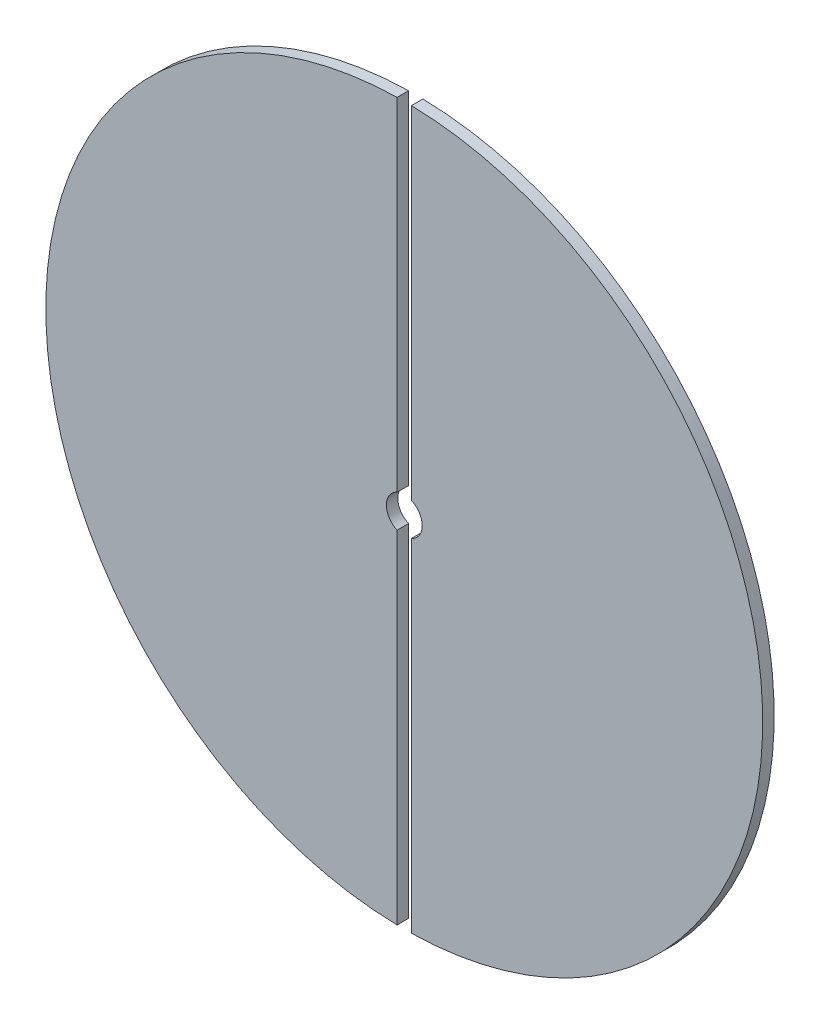
ISO-10303-21;
HEADER;
FILE_DESCRIPTION(('STEP AP214'),'2;1');
FILE_NAME('part.step','',(''),(''),'','','');
FILE_SCHEMA(('AUTOMOTIVE_DESIGN { 1 0 10303 214 1 1 1 1 }'));
ENDSEC;
DATA;
#1=APPLICATION_CONTEXT('core data for automotive mechanical design processes');
#2=APPLICATION_PROTOCOL_DEFINITION('international standard','automotive_design',2000,#1);
#3=PRODUCT_CONTEXT('',#1,'mechanical');
#4=PRODUCT('Part','Part','',(#3));
#5=PRODUCT_RELATED_PRODUCT_CATEGORY('part','',(#4));
#6=PRODUCT_DEFINITION_FORMATION('','',#4);
#7=PRODUCT_DEFINITION_CONTEXT('part definition',#1,'design');
#8=PRODUCT_DEFINITION('design','',#6,#7);
#9=PRODUCT_DEFINITION_SHAPE('','',#8);
#10=(LENGTH_UNIT() NAMED_UNIT(*) SI_UNIT(.MILLI.,.METRE.));
#11=(NAMED_UNIT(*) PLANE_ANGLE_UNIT() SI_UNIT($,.RADIAN.));
#12=(NAMED_UNIT(*) SI_UNIT($,.STERADIAN.) SOLID_ANGLE_UNIT());
#13=UNCERTAINTY_MEASURE_WITH_UNIT(LENGTH_MEASURE(1.E-05),#10,'distance_accuracy_value','');
#14=(GEOMETRIC_REPRESENTATION_CONTEXT(3) GLOBAL_UNCERTAINTY_ASSIGNED_CONTEXT((#13)) GLOBAL_UNIT_ASSIGNED_CONTEXT((#10,
#11,#12)) REPRESENTATION_CONTEXT('',''));
#15=CARTESIAN_POINT('',(0.,0.,0.));
#16=DIRECTION('',(0.,0.,1.));
#17=DIRECTION('',(1.,0.,0.));
#18=AXIS2_PLACEMENT_3D('',#15,#16,#17);
#19=CARTESIAN_POINT('',(0.,0.,1.6));
#20=DIRECTION('',(0.,0.,-1.));
#21=DIRECTION('',(-1.,0.,0.));
#22=AXIS2_PLACEMENT_3D('',#19,#20,#21);
#23=CYLINDRICAL_SURFACE('',#22,50.);
#24=CARTESIAN_POINT('',(0.,0.,0.));
#25=DIRECTION('',(0.,0.,1.));
#26=DIRECTION('',(1.,0.,0.));
#27=AXIS2_PLACEMENT_3D('',#24,#25,#26);
#28=CIRCLE('',#27,50.);
#29=CARTESIAN_POINT('',(1.00000000000001,-49.9899989998,0.));
#30=VERTEX_POINT('',#29);
#31=CARTESIAN_POINT('',(1.00000000000001,49.9899989998,0.));
#32=VERTEX_POINT('',#31);
#33=EDGE_CURVE('E121',#30,#32,#28,.T.);
#34=ORIENTED_EDGE('',*,*,#33,.T.);
#35=DIRECTION('',(0.,0.,-1.));
#36=VECTOR('',#35,1.);
#37=CARTESIAN_POINT('',(1.00000000000001,49.9899989998,1.6));
#38=LINE('',#37,#36);
#39=CARTESIAN_POINT('',(1.00000000000001,49.9899989998,1.6));
#40=VERTEX_POINT('',#39);
#41=EDGE_CURVE('E12',#40,#32,#38,.T.);
#42=ORIENTED_EDGE('',*,*,#41,.F.);
#43=CARTESIAN_POINT('',(0.,0.,1.6));
#44=DIRECTION('',(0.,0.,1.));
#45=DIRECTION('',(1.,0.,0.));
#46=AXIS2_PLACEMENT_3D('',#43,#44,#45);
#47=CIRCLE('',#46,50.);
#48=CARTESIAN_POINT('',(1.00000000000001,-49.9899989998,1.6));
#49=VERTEX_POINT('',#48);
#50=EDGE_CURVE('E105',#49,#40,#47,.T.);
#51=ORIENTED_EDGE('',*,*,#50,.F.);
#52=DIRECTION('',(0.,0.,-1.));
#53=VECTOR('',#52,1.);
#54=CARTESIAN_POINT('',(1.00000000000001,-49.9899989998,1.6));
#55=LINE('',#54,#53);
#56=EDGE_CURVE('E117',#49,#30,#55,.T.);
#57=ORIENTED_EDGE('',*,*,#56,.T.);
#58=EDGE_LOOP('',(#34,#42,#51,#57));
#59=FACE_BOUND('',#58,.T.);
#60=ADVANCED_FACE('F53',(#59),#23,.T.);
#61=CARTESIAN_POINT('',(1.00000000000001,49.9899989998,1.6));
#62=DIRECTION('',(1.,0.,0.));
#63=DIRECTION('',(0.,1.,0.));
#64=AXIS2_PLACEMENT_3D('',#61,#62,#63);
#65=PLANE('',#64);
#66=DIRECTION('',(0.,-1.,0.));
#67=VECTOR('',#66,1.);
#68=CARTESIAN_POINT('',(1.00000000000001,49.9899989998,0.));
#69=LINE('',#68,#67);
#70=CARTESIAN_POINT('',(1.00000000000001,2.29128784747792,0.));
#71=VERTEX_POINT('',#70);
#72=EDGE_CURVE('E110',#32,#71,#69,.T.);
#73=ORIENTED_EDGE('',*,*,#72,.T.);
#74=DIRECTION('',(0.,0.,-1.));
#75=VECTOR('',#74,1.);
#76=CARTESIAN_POINT('',(1.00000000000001,2.29128784747792,1.6));
#77=LINE('',#76,#75);
#78=CARTESIAN_POINT('',(1.00000000000001,2.29128784747792,1.6));
#79=VERTEX_POINT('',#78);
#80=EDGE_CURVE('E62',#79,#71,#77,.T.);
#81=ORIENTED_EDGE('',*,*,#80,.F.);
#82=DIRECTION('',(0.,-1.,0.));
#83=VECTOR('',#82,1.);
#84=CARTESIAN_POINT('',(1.00000000000001,49.9899989998,1.6));
#85=LINE('',#84,#83);
#86=EDGE_CURVE('E100',#40,#79,#85,.T.);
#87=ORIENTED_EDGE('',*,*,#86,.F.);
#88=ORIENTED_EDGE('',*,*,#41,.T.);
#89=EDGE_LOOP('',(#73,#81,#87,#88));
#90=FACE_BOUND('',#89,.T.);
#91=ADVANCED_FACE('F109',(#90),#65,.F.);
#92=CARTESIAN_POINT('',(0.,0.,1.6));
#93=DIRECTION('',(0.,0.,-1.));
#94=DIRECTION('',(-1.,0.,0.));
#95=AXIS2_PLACEMENT_3D('',#92,#93,#94);
#96=CYLINDRICAL_SURFACE('',#95,2.5);
#97=CARTESIAN_POINT('',(0.,0.,0.));
#98=DIRECTION('',(0.,0.,-1.));
#99=DIRECTION('',(1.,0.,0.));
#100=AXIS2_PLACEMENT_3D('',#97,#98,#99);
#101=CIRCLE('',#100,2.5);
#102=CARTESIAN_POINT('',(1.00000000000001,-2.29128784747792,0.));
#103=VERTEX_POINT('',#102);
#104=EDGE_CURVE('E87',#71,#103,#101,.T.);
#105=ORIENTED_EDGE('',*,*,#104,.T.);
#106=DIRECTION('',(0.,0.,-1.));
#107=VECTOR('',#106,1.);
#108=CARTESIAN_POINT('',(1.00000000000001,-2.29128784747792,1.6));
#109=LINE('',#108,#107);
#110=CARTESIAN_POINT('',(1.00000000000001,-2.29128784747792,1.6));
#111=VERTEX_POINT('',#110);
#112=EDGE_CURVE('E112',#111,#103,#109,.T.);
#113=ORIENTED_EDGE('',*,*,#112,.F.);
#114=CARTESIAN_POINT('',(0.,0.,1.6));
#115=DIRECTION('',(0.,0.,-1.));
#116=DIRECTION('',(1.,0.,0.));
#117=AXIS2_PLACEMENT_3D('',#114,#115,#116);
#118=CIRCLE('',#117,2.5);
#119=EDGE_CURVE('E103',#79,#111,#118,.T.);
#120=ORIENTED_EDGE('',*,*,#119,.F.);
#121=ORIENTED_EDGE('',*,*,#80,.T.);
#122=EDGE_LOOP('',(#105,#113,#120,#121));
#123=FACE_BOUND('',#122,.T.);
#124=ADVANCED_FACE('F113',(#123),#96,.F.);
#125=CARTESIAN_POINT('',(1.00000000000001,-2.29128784747792,1.6));
#126=DIRECTION('',(1.,0.,0.));
#127=DIRECTION('',(0.,1.,0.));
#128=AXIS2_PLACEMENT_3D('',#125,#126,#127);
#129=PLANE('',#128);
#130=DIRECTION('',(0.,-1.,0.));
#131=VECTOR('',#130,1.);
#132=CARTESIAN_POINT('',(1.00000000000001,-2.29128784747792,0.));
#133=LINE('',#132,#131);
#134=EDGE_CURVE('E93',#103,#30,#133,.T.);
#135=ORIENTED_EDGE('',*,*,#134,.T.);
#136=ORIENTED_EDGE('',*,*,#56,.F.);
#137=DIRECTION('',(0.,-1.,0.));
#138=VECTOR('',#137,1.);
#139=CARTESIAN_POINT('',(1.00000000000001,-2.29128784747792,1.6));
#140=LINE('',#139,#138);
#141=EDGE_CURVE('E70',#111,#49,#140,.T.);
#142=ORIENTED_EDGE('',*,*,#141,.F.);
#143=ORIENTED_EDGE('',*,*,#112,.T.);
#144=EDGE_LOOP('',(#135,#136,#142,#143));
#145=FACE_BOUND('',#144,.T.);
#146=ADVANCED_FACE('F134',(#145),#129,.F.);
#147=CARTESIAN_POINT('',(0.,0.,1.6));
#148=DIRECTION('',(0.,0.,1.));
#149=DIRECTION('',(1.,0.,0.));
#150=AXIS2_PLACEMENT_3D('',#147,#148,#149);
#151=PLANE('',#150);
#152=ORIENTED_EDGE('',*,*,#50,.T.);
#153=ORIENTED_EDGE('',*,*,#86,.T.);
#154=ORIENTED_EDGE('',*,*,#119,.T.);
#155=ORIENTED_EDGE('',*,*,#141,.T.);
#156=EDGE_LOOP('',(#152,#153,#154,#155));
#157=FACE_BOUND('',#156,.T.);
#158=ADVANCED_FACE('F101',(#157),#151,.T.);
#159=CARTESIAN_POINT('',(0.,0.,0.));
#160=DIRECTION('',(0.,0.,1.));
#161=DIRECTION('',(1.,0.,0.));
#162=AXIS2_PLACEMENT_3D('',#159,#160,#161);
#163=PLANE('',#162);
#164=ORIENTED_EDGE('',*,*,#33,.F.);
#165=ORIENTED_EDGE('',*,*,#134,.F.);
#166=ORIENTED_EDGE('',*,*,#104,.F.);
#167=ORIENTED_EDGE('',*,*,#72,.F.);
#168=EDGE_LOOP('',(#164,#165,#166,#167));
#169=FACE_BOUND('',#168,.T.);
#170=ADVANCED_FACE('F137',(#169),#163,.F.);
#171=CLOSED_SHELL('',(#60,#91,#124,#146,#158,#170));
#172=MANIFOLD_SOLID_BREP('B2',#171);
#173=CARTESIAN_POINT('',(0.,0.,1.6));
#174=DIRECTION('',(0.,0.,-1.));
#175=DIRECTION('',(-1.,0.,0.));
#176=AXIS2_PLACEMENT_3D('',#173,#174,#175);
#177=CYLINDRICAL_SURFACE('',#176,50.);
#178=CARTESIAN_POINT('',(0.,0.,0.));
#179=DIRECTION('',(0.,0.,1.));
#180=DIRECTION('',(1.,0.,0.));
#181=AXIS2_PLACEMENT_3D('',#178,#179,#180);
#182=CIRCLE('',#181,50.);
#183=CARTESIAN_POINT('',(-1.00000000000001,49.9899989998,0.));
#184=VERTEX_POINT('',#183);
#185=CARTESIAN_POINT('',(-1.00000000000001,-49.9899989998,0.));
#186=VERTEX_POINT('',#185);
#187=EDGE_CURVE('E254',#184,#186,#182,.T.);
#188=ORIENTED_EDGE('',*,*,#187,.T.);
#189=DIRECTION('',(0.,0.,-1.));
#190=VECTOR('',#189,1.);
#191=CARTESIAN_POINT('',(-1.00000000000001,-49.9899989998,1.6));
#192=LINE('',#191,#190);
#193=CARTESIAN_POINT('',(-1.00000000000001,-49.9899989998,1.6));
#194=VERTEX_POINT('',#193);
#195=EDGE_CURVE('E51',#194,#186,#192,.T.);
#196=ORIENTED_EDGE('',*,*,#195,.F.);
#197=CARTESIAN_POINT('',(0.,0.,1.6));
#198=DIRECTION('',(0.,0.,1.));
#199=DIRECTION('',(1.,0.,0.));
#200=AXIS2_PLACEMENT_3D('',#197,#198,#199);
#201=CIRCLE('',#200,50.);
#202=CARTESIAN_POINT('',(-1.00000000000001,49.9899989998,1.6));
#203=VERTEX_POINT('',#202);
#204=EDGE_CURVE('E242',#203,#194,#201,.T.);
#205=ORIENTED_EDGE('',*,*,#204,.F.);
#206=DIRECTION('',(0.,0.,-1.));
#207=VECTOR('',#206,1.);
#208=CARTESIAN_POINT('',(-1.00000000000001,49.9899989998,1.6));
#209=LINE('',#208,#207);
#210=EDGE_CURVE('E250',#203,#184,#209,.T.);
#211=ORIENTED_EDGE('',*,*,#210,.T.);
#212=EDGE_LOOP('',(#188,#196,#205,#211));
#213=FACE_BOUND('',#212,.T.);
#214=ADVANCED_FACE('F191',(#213),#177,.T.);
#215=CARTESIAN_POINT('',(-1.00000000000001,-2.29128784747792,1.6));
#216=DIRECTION('',(-1.,0.,0.));
#217=DIRECTION('',(0.,-1.,0.));
#218=AXIS2_PLACEMENT_3D('',#215,#216,#217);
#219=PLANE('',#218);
#220=DIRECTION('',(0.,1.,0.));
#221=VECTOR('',#220,1.);
#222=CARTESIAN_POINT('',(-1.00000000000001,-2.29128784747792,0.));
#223=LINE('',#222,#221);
#224=CARTESIAN_POINT('',(-1.00000000000001,-2.29128784747792,0.));
#225=VERTEX_POINT('',#224);
#226=EDGE_CURVE('E246',#186,#225,#223,.T.);
#227=ORIENTED_EDGE('',*,*,#226,.T.);
#228=DIRECTION('',(0.,0.,-1.));
#229=VECTOR('',#228,1.);
#230=CARTESIAN_POINT('',(-1.00000000000001,-2.29128784747792,1.6));
#231=LINE('',#230,#229);
#232=CARTESIAN_POINT('',(-1.00000000000001,-2.29128784747792,1.6));
#233=VERTEX_POINT('',#232);
#234=EDGE_CURVE('E199',#233,#225,#231,.T.);
#235=ORIENTED_EDGE('',*,*,#234,.F.);
#236=DIRECTION('',(0.,1.,0.));
#237=VECTOR('',#236,1.);
#238=CARTESIAN_POINT('',(-1.00000000000001,-2.29128784747792,1.6));
#239=LINE('',#238,#237);
#240=EDGE_CURVE('E237',#194,#233,#239,.T.);
#241=ORIENTED_EDGE('',*,*,#240,.F.);
#242=ORIENTED_EDGE('',*,*,#195,.T.);
#243=EDGE_LOOP('',(#227,#235,#241,#242));
#244=FACE_BOUND('',#243,.T.);
#245=ADVANCED_FACE('F245',(#244),#219,.F.);
#246=CARTESIAN_POINT('',(0.,0.,1.6));
#247=DIRECTION('',(0.,0.,-1.));
#248=DIRECTION('',(-1.,0.,0.));
#249=AXIS2_PLACEMENT_3D('',#246,#247,#248);
#250=CYLINDRICAL_SURFACE('',#249,2.5);
#251=CARTESIAN_POINT('',(0.,0.,0.));
#252=DIRECTION('',(0.,0.,-1.));
#253=DIRECTION('',(1.,0.,0.));
#254=AXIS2_PLACEMENT_3D('',#251,#252,#253);
#255=CIRCLE('',#254,2.5);
#256=CARTESIAN_POINT('',(-1.00000000000001,2.29128784747792,0.));
#257=VERTEX_POINT('',#256);
#258=EDGE_CURVE('E224',#225,#257,#255,.T.);
#259=ORIENTED_EDGE('',*,*,#258,.T.);
#260=DIRECTION('',(0.,0.,-1.));
#261=VECTOR('',#260,1.);
#262=CARTESIAN_POINT('',(-1.00000000000001,2.29128784747792,1.6));
#263=LINE('',#262,#261);
#264=CARTESIAN_POINT('',(-1.00000000000001,2.29128784747792,1.6));
#265=VERTEX_POINT('',#264);
#266=EDGE_CURVE('E247',#265,#257,#263,.T.);
#267=ORIENTED_EDGE('',*,*,#266,.F.);
#268=CARTESIAN_POINT('',(0.,0.,1.6));
#269=DIRECTION('',(0.,0.,-1.));
#270=DIRECTION('',(1.,0.,0.));
#271=AXIS2_PLACEMENT_3D('',#268,#269,#270);
#272=CIRCLE('',#271,2.5);
#273=EDGE_CURVE('E240',#233,#265,#272,.T.);
#274=ORIENTED_EDGE('',*,*,#273,.F.);
#275=ORIENTED_EDGE('',*,*,#234,.T.);
#276=EDGE_LOOP('',(#259,#267,#274,#275));
#277=FACE_BOUND('',#276,.T.);
#278=ADVANCED_FACE('F248',(#277),#250,.F.);
#279=CARTESIAN_POINT('',(-1.00000000000001,49.9899989998,1.6));
#280=DIRECTION('',(-1.,0.,0.));
#281=DIRECTION('',(0.,-1.,0.));
#282=AXIS2_PLACEMENT_3D('',#279,#280,#281);
#283=PLANE('',#282);
#284=DIRECTION('',(0.,1.,0.));
#285=VECTOR('',#284,1.);
#286=CARTESIAN_POINT('',(-1.00000000000001,49.9899989998,0.));
#287=LINE('',#286,#285);
#288=EDGE_CURVE('E230',#257,#184,#287,.T.);
#289=ORIENTED_EDGE('',*,*,#288,.T.);
#290=ORIENTED_EDGE('',*,*,#210,.F.);
#291=DIRECTION('',(0.,1.,0.));
#292=VECTOR('',#291,1.);
#293=CARTESIAN_POINT('',(-1.00000000000001,49.9899989998,1.6));
#294=LINE('',#293,#292);
#295=EDGE_CURVE('E207',#265,#203,#294,.T.);
#296=ORIENTED_EDGE('',*,*,#295,.F.);
#297=ORIENTED_EDGE('',*,*,#266,.T.);
#298=EDGE_LOOP('',(#289,#290,#296,#297));
#299=FACE_BOUND('',#298,.T.);
#300=ADVANCED_FACE('F261',(#299),#283,.F.);
#301=CARTESIAN_POINT('',(0.,0.,1.6));
#302=DIRECTION('',(0.,0.,1.));
#303=DIRECTION('',(1.,0.,0.));
#304=AXIS2_PLACEMENT_3D('',#301,#302,#303);
#305=PLANE('',#304);
#306=ORIENTED_EDGE('',*,*,#204,.T.);
#307=ORIENTED_EDGE('',*,*,#240,.T.);
#308=ORIENTED_EDGE('',*,*,#273,.T.);
#309=ORIENTED_EDGE('',*,*,#295,.T.);
#310=EDGE_LOOP('',(#306,#307,#308,#309));
#311=FACE_BOUND('',#310,.T.);
#312=ADVANCED_FACE('F238',(#311),#305,.T.);
#313=CARTESIAN_POINT('',(0.,0.,0.));
#314=DIRECTION('',(0.,0.,1.));
#315=DIRECTION('',(1.,0.,0.));
#316=AXIS2_PLACEMENT_3D('',#313,#314,#315);
#317=PLANE('',#316);
#318=ORIENTED_EDGE('',*,*,#187,.F.);
#319=ORIENTED_EDGE('',*,*,#288,.F.);
#320=ORIENTED_EDGE('',*,*,#258,.F.);
#321=ORIENTED_EDGE('',*,*,#226,.F.);
#322=EDGE_LOOP('',(#318,#319,#320,#321));
#323=FACE_BOUND('',#322,.T.);
#324=ADVANCED_FACE('F264',(#323),#317,.F.);
#325=CLOSED_SHELL('',(#214,#245,#278,#300,#312,#324));
#326=MANIFOLD_SOLID_BREP('B6',#325);
#327=ADVANCED_BREP_SHAPE_REPRESENTATION('',(#18,#172,#326),#14);
#328=SHAPE_DEFINITION_REPRESENTATION(#9,#327);
ENDSEC;
END-ISO-10303-21;
